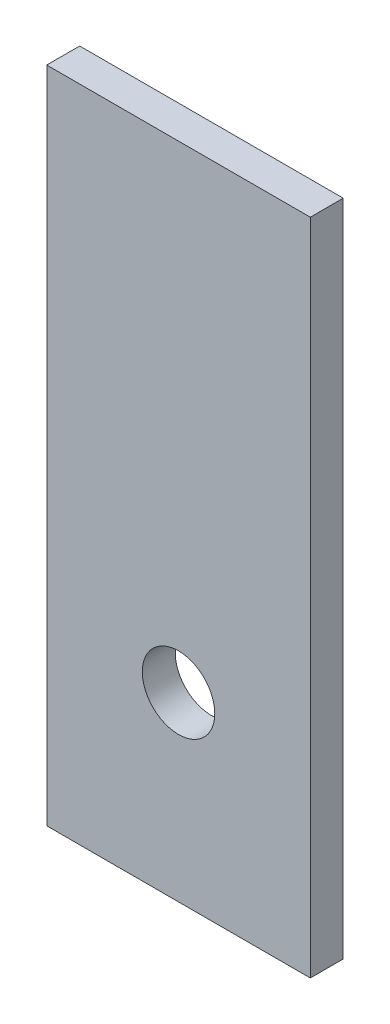
ISO-10303-21;
HEADER;
FILE_DESCRIPTION(('STEP AP214'),'2;1');
FILE_NAME('part.step','',(''),(''),'','','');
FILE_SCHEMA(('AUTOMOTIVE_DESIGN { 1 0 10303 214 1 1 1 1 }'));
ENDSEC;
DATA;
#1=APPLICATION_CONTEXT('core data for automotive mechanical design processes');
#2=APPLICATION_PROTOCOL_DEFINITION('international standard','automotive_design',2000,#1);
#3=PRODUCT_CONTEXT('',#1,'mechanical');
#4=PRODUCT('Part','Part','',(#3));
#5=PRODUCT_RELATED_PRODUCT_CATEGORY('part','',(#4));
#6=PRODUCT_DEFINITION_FORMATION('','',#4);
#7=PRODUCT_DEFINITION_CONTEXT('part definition',#1,'design');
#8=PRODUCT_DEFINITION('design','',#6,#7);
#9=PRODUCT_DEFINITION_SHAPE('','',#8);
#10=(LENGTH_UNIT() NAMED_UNIT(*) SI_UNIT(.MILLI.,.METRE.));
#11=(NAMED_UNIT(*) PLANE_ANGLE_UNIT() SI_UNIT($,.RADIAN.));
#12=(NAMED_UNIT(*) SI_UNIT($,.STERADIAN.) SOLID_ANGLE_UNIT());
#13=UNCERTAINTY_MEASURE_WITH_UNIT(LENGTH_MEASURE(1.E-05),#10,'distance_accuracy_value','');
#14=(GEOMETRIC_REPRESENTATION_CONTEXT(3) GLOBAL_UNCERTAINTY_ASSIGNED_CONTEXT((#13)) GLOBAL_UNIT_ASSIGNED_CONTEXT((#10,
#11,#12)) REPRESENTATION_CONTEXT('',''));
#15=CARTESIAN_POINT('',(0.,0.,0.));
#16=DIRECTION('',(0.,0.,1.));
#17=DIRECTION('',(1.,0.,0.));
#18=AXIS2_PLACEMENT_3D('',#15,#16,#17);
#19=CARTESIAN_POINT('',(0.,0.,10.));
#20=DIRECTION('',(0.,0.,-1.));
#21=DIRECTION('',(-1.,0.,0.));
#22=AXIS2_PLACEMENT_3D('',#19,#20,#21);
#23=PLANE('',#22);
#24=DIRECTION('',(0.,-1.,0.));
#25=VECTOR('',#24,1.);
#26=CARTESIAN_POINT('',(0.,0.,10.));
#27=LINE('',#26,#25);
#28=CARTESIAN_POINT('',(0.,200.,10.));
#29=VERTEX_POINT('',#28);
#30=CARTESIAN_POINT('',(0.,0.,10.));
#31=VERTEX_POINT('',#30);
#32=EDGE_CURVE('E98',#29,#31,#27,.T.);
#33=ORIENTED_EDGE('',*,*,#32,.T.);
#34=DIRECTION('',(1.,0.,0.));
#35=VECTOR('',#34,1.);
#36=CARTESIAN_POINT('',(0.,0.,10.));
#37=LINE('',#36,#35);
#38=CARTESIAN_POINT('',(80.,0.,10.));
#39=VERTEX_POINT('',#38);
#40=EDGE_CURVE('E93',#31,#39,#37,.T.);
#41=ORIENTED_EDGE('',*,*,#40,.T.);
#42=DIRECTION('',(0.,1.,0.));
#43=VECTOR('',#42,1.);
#44=CARTESIAN_POINT('',(80.,0.,10.));
#45=LINE('',#44,#43);
#46=CARTESIAN_POINT('',(80.,200.,10.));
#47=VERTEX_POINT('',#46);
#48=EDGE_CURVE('E96',#39,#47,#45,.T.);
#49=ORIENTED_EDGE('',*,*,#48,.T.);
#50=DIRECTION('',(-1.,0.,0.));
#51=VECTOR('',#50,1.);
#52=CARTESIAN_POINT('',(0.,200.,10.));
#53=LINE('',#52,#51);
#54=EDGE_CURVE('E63',#47,#29,#53,.T.);
#55=ORIENTED_EDGE('',*,*,#54,.T.);
#56=EDGE_LOOP('',(#33,#41,#49,#55));
#57=FACE_BOUND('',#56,.T.);
#58=CARTESIAN_POINT('',(40.,55.,10.));
#59=DIRECTION('',(0.,0.,1.));
#60=DIRECTION('',(1.,0.,0.));
#61=AXIS2_PLACEMENT_3D('',#58,#59,#60);
#62=CIRCLE('',#61,11.);
#63=CARTESIAN_POINT('',(51.,55.,10.));
#64=VERTEX_POINT('',#63);
#65=EDGE_CURVE('E118',#64,#64,#62,.T.);
#66=ORIENTED_EDGE('',*,*,#65,.F.);
#67=EDGE_LOOP('',(#66));
#68=FACE_BOUND('',#67,.T.);
#69=ADVANCED_FACE('F45',(#57,#68),#23,.F.);
#70=CARTESIAN_POINT('',(0.,0.,0.));
#71=DIRECTION('',(0.,0.,-1.));
#72=DIRECTION('',(-1.,0.,0.));
#73=AXIS2_PLACEMENT_3D('',#70,#71,#72);
#74=PLANE('',#73);
#75=DIRECTION('',(0.,-1.,0.));
#76=VECTOR('',#75,1.);
#77=CARTESIAN_POINT('',(0.,0.,0.));
#78=LINE('',#77,#76);
#79=CARTESIAN_POINT('',(0.,200.,0.));
#80=VERTEX_POINT('',#79);
#81=CARTESIAN_POINT('',(0.,0.,0.));
#82=VERTEX_POINT('',#81);
#83=EDGE_CURVE('E114',#80,#82,#78,.T.);
#84=ORIENTED_EDGE('',*,*,#83,.F.);
#85=DIRECTION('',(-1.,0.,0.));
#86=VECTOR('',#85,1.);
#87=CARTESIAN_POINT('',(0.,200.,0.));
#88=LINE('',#87,#86);
#89=CARTESIAN_POINT('',(80.,200.,0.));
#90=VERTEX_POINT('',#89);
#91=EDGE_CURVE('E86',#90,#80,#88,.T.);
#92=ORIENTED_EDGE('',*,*,#91,.F.);
#93=DIRECTION('',(0.,1.,0.));
#94=VECTOR('',#93,1.);
#95=CARTESIAN_POINT('',(80.,0.,0.));
#96=LINE('',#95,#94);
#97=CARTESIAN_POINT('',(80.,0.,0.));
#98=VERTEX_POINT('',#97);
#99=EDGE_CURVE('E80',#98,#90,#96,.T.);
#100=ORIENTED_EDGE('',*,*,#99,.F.);
#101=DIRECTION('',(1.,0.,0.));
#102=VECTOR('',#101,1.);
#103=CARTESIAN_POINT('',(0.,0.,0.));
#104=LINE('',#103,#102);
#105=EDGE_CURVE('E103',#82,#98,#104,.T.);
#106=ORIENTED_EDGE('',*,*,#105,.F.);
#107=EDGE_LOOP('',(#84,#92,#100,#106));
#108=FACE_BOUND('',#107,.T.);
#109=CARTESIAN_POINT('',(40.,55.,0.));
#110=DIRECTION('',(0.,0.,1.));
#111=DIRECTION('',(1.,0.,0.));
#112=AXIS2_PLACEMENT_3D('',#109,#110,#111);
#113=CIRCLE('',#112,11.);
#114=CARTESIAN_POINT('',(51.,55.,0.));
#115=VERTEX_POINT('',#114);
#116=EDGE_CURVE('E136',#115,#115,#113,.T.);
#117=ORIENTED_EDGE('',*,*,#116,.T.);
#118=EDGE_LOOP('',(#117));
#119=FACE_BOUND('',#118,.T.);
#120=ADVANCED_FACE('F131',(#108,#119),#74,.T.);
#121=CARTESIAN_POINT('',(0.,0.,10.));
#122=DIRECTION('',(1.,0.,0.));
#123=DIRECTION('',(0.,1.,0.));
#124=AXIS2_PLACEMENT_3D('',#121,#122,#123);
#125=PLANE('',#124);
#126=ORIENTED_EDGE('',*,*,#83,.T.);
#127=DIRECTION('',(0.,0.,-1.));
#128=VECTOR('',#127,1.);
#129=CARTESIAN_POINT('',(0.,0.,10.));
#130=LINE('',#129,#128);
#131=EDGE_CURVE('E11',#31,#82,#130,.T.);
#132=ORIENTED_EDGE('',*,*,#131,.F.);
#133=ORIENTED_EDGE('',*,*,#32,.F.);
#134=DIRECTION('',(0.,0.,-1.));
#135=VECTOR('',#134,1.);
#136=CARTESIAN_POINT('',(0.,200.,10.));
#137=LINE('',#136,#135);
#138=EDGE_CURVE('E110',#29,#80,#137,.T.);
#139=ORIENTED_EDGE('',*,*,#138,.T.);
#140=EDGE_LOOP('',(#126,#132,#133,#139));
#141=FACE_BOUND('',#140,.T.);
#142=ADVANCED_FACE('F47',(#141),#125,.F.);
#143=CARTESIAN_POINT('',(0.,0.,10.));
#144=DIRECTION('',(0.,1.,0.));
#145=DIRECTION('',(0.,0.,1.));
#146=AXIS2_PLACEMENT_3D('',#143,#144,#145);
#147=PLANE('',#146);
#148=ORIENTED_EDGE('',*,*,#105,.T.);
#149=DIRECTION('',(0.,0.,-1.));
#150=VECTOR('',#149,1.);
#151=CARTESIAN_POINT('',(80.,0.,10.));
#152=LINE('',#151,#150);
#153=EDGE_CURVE('E55',#39,#98,#152,.T.);
#154=ORIENTED_EDGE('',*,*,#153,.F.);
#155=ORIENTED_EDGE('',*,*,#40,.F.);
#156=ORIENTED_EDGE('',*,*,#131,.T.);
#157=EDGE_LOOP('',(#148,#154,#155,#156));
#158=FACE_BOUND('',#157,.T.);
#159=ADVANCED_FACE('F102',(#158),#147,.F.);
#160=CARTESIAN_POINT('',(80.,0.,10.));
#161=DIRECTION('',(-1.,0.,0.));
#162=DIRECTION('',(0.,-1.,0.));
#163=AXIS2_PLACEMENT_3D('',#160,#161,#162);
#164=PLANE('',#163);
#165=ORIENTED_EDGE('',*,*,#99,.T.);
#166=DIRECTION('',(0.,0.,-1.));
#167=VECTOR('',#166,1.);
#168=CARTESIAN_POINT('',(80.,200.,10.));
#169=LINE('',#168,#167);
#170=EDGE_CURVE('E105',#47,#90,#169,.T.);
#171=ORIENTED_EDGE('',*,*,#170,.F.);
#172=ORIENTED_EDGE('',*,*,#48,.F.);
#173=ORIENTED_EDGE('',*,*,#153,.T.);
#174=EDGE_LOOP('',(#165,#171,#172,#173));
#175=FACE_BOUND('',#174,.T.);
#176=ADVANCED_FACE('F106',(#175),#164,.F.);
#177=CARTESIAN_POINT('',(0.,200.,10.));
#178=DIRECTION('',(0.,-1.,0.));
#179=DIRECTION('',(0.,0.,-1.));
#180=AXIS2_PLACEMENT_3D('',#177,#178,#179);
#181=PLANE('',#180);
#182=ORIENTED_EDGE('',*,*,#91,.T.);
#183=ORIENTED_EDGE('',*,*,#138,.F.);
#184=ORIENTED_EDGE('',*,*,#54,.F.);
#185=ORIENTED_EDGE('',*,*,#170,.T.);
#186=EDGE_LOOP('',(#182,#183,#184,#185));
#187=FACE_BOUND('',#186,.T.);
#188=ADVANCED_FACE('F128',(#187),#181,.F.);
#189=CARTESIAN_POINT('',(40.,55.,10.));
#190=DIRECTION('',(0.,0.,-1.));
#191=DIRECTION('',(-1.,0.,0.));
#192=AXIS2_PLACEMENT_3D('',#189,#190,#191);
#193=CYLINDRICAL_SURFACE('',#192,11.);
#194=ORIENTED_EDGE('',*,*,#65,.T.);
#195=EDGE_LOOP('',(#194));
#196=FACE_BOUND('',#195,.T.);
#197=ORIENTED_EDGE('',*,*,#116,.F.);
#198=EDGE_LOOP('',(#197));
#199=FACE_BOUND('',#198,.T.);
#200=ADVANCED_FACE('F144',(#196,#199),#193,.F.);
#201=CLOSED_SHELL('',(#69,#120,#142,#159,#176,#188,#200));
#202=MANIFOLD_SOLID_BREP('B2',#201);
#203=ADVANCED_BREP_SHAPE_REPRESENTATION('',(#18,#202),#14);
#204=SHAPE_DEFINITION_REPRESENTATION(#9,#203);
ENDSEC;
END-ISO-10303-21;
